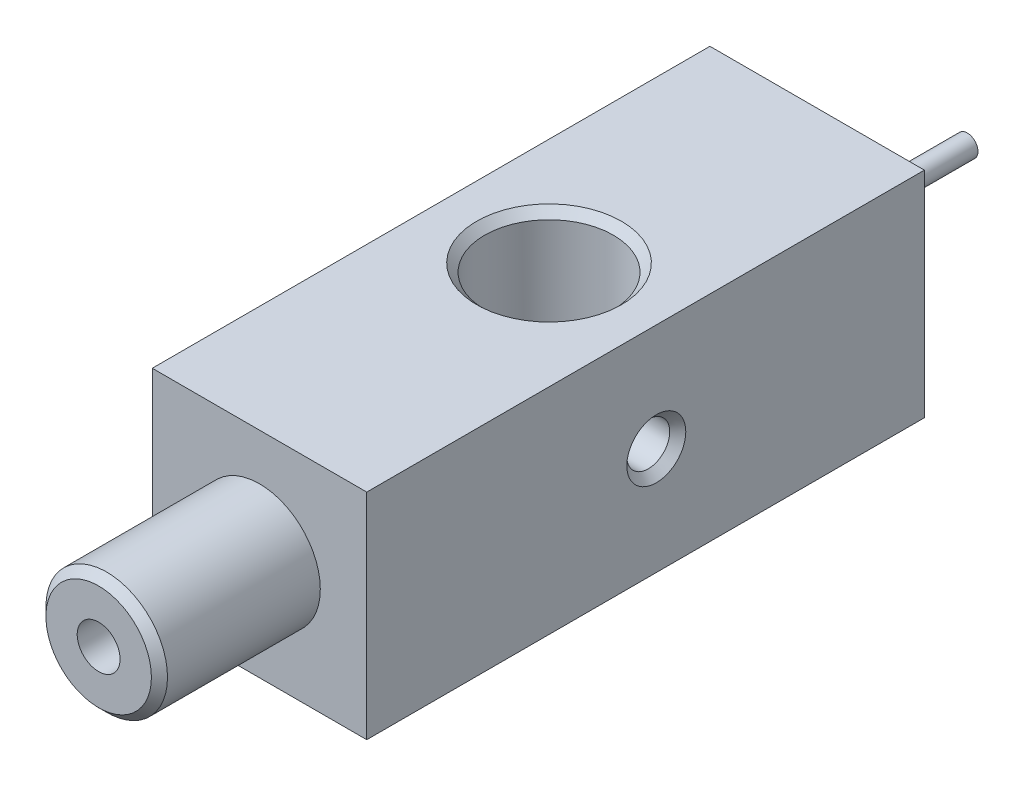
ISO-10303-21;
HEADER;
FILE_DESCRIPTION(('STEP AP214'),'2;1');
FILE_NAME('part.step','',(''),(''),'','','');
FILE_SCHEMA(('AUTOMOTIVE_DESIGN { 1 0 10303 214 1 1 1 1 }'));
ENDSEC;
DATA;
#1=APPLICATION_CONTEXT('core data for automotive mechanical design processes');
#2=APPLICATION_PROTOCOL_DEFINITION('international standard','automotive_design',2000,#1);
#3=PRODUCT_CONTEXT('',#1,'mechanical');
#4=PRODUCT('Part','Part','',(#3));
#5=PRODUCT_RELATED_PRODUCT_CATEGORY('part','',(#4));
#6=PRODUCT_DEFINITION_FORMATION('','',#4);
#7=PRODUCT_DEFINITION_CONTEXT('part definition',#1,'design');
#8=PRODUCT_DEFINITION('design','',#6,#7);
#9=PRODUCT_DEFINITION_SHAPE('','',#8);
#10=(LENGTH_UNIT() NAMED_UNIT(*) SI_UNIT(.MILLI.,.METRE.));
#11=(NAMED_UNIT(*) PLANE_ANGLE_UNIT() SI_UNIT($,.RADIAN.));
#12=(NAMED_UNIT(*) SI_UNIT($,.STERADIAN.) SOLID_ANGLE_UNIT());
#13=UNCERTAINTY_MEASURE_WITH_UNIT(LENGTH_MEASURE(1.E-05),#10,'distance_accuracy_value','');
#14=(GEOMETRIC_REPRESENTATION_CONTEXT(3) GLOBAL_UNCERTAINTY_ASSIGNED_CONTEXT((#13)) GLOBAL_UNIT_ASSIGNED_CONTEXT((#10,
#11,#12)) REPRESENTATION_CONTEXT('',''));
#15=CARTESIAN_POINT('',(0.,0.,0.));
#16=DIRECTION('',(0.,0.,1.));
#17=DIRECTION('',(1.,0.,0.));
#18=AXIS2_PLACEMENT_3D('',#15,#16,#17);
#19=CARTESIAN_POINT('',(-7.94,-7.935,14.288));
#20=DIRECTION('',(0.,0.,1.));
#21=DIRECTION('',(1.,0.,0.));
#22=AXIS2_PLACEMENT_3D('',#19,#20,#21);
#23=PLANE('',#22);
#24=CARTESIAN_POINT('',(-7.94,-7.935,14.288));
#25=DIRECTION('',(0.,0.,1.));
#26=DIRECTION('',(1.,0.,0.));
#27=AXIS2_PLACEMENT_3D('',#24,#25,#26);
#28=CIRCLE('',#27,1.5875);
#29=CARTESIAN_POINT('',(-6.3525,-7.935,14.288));
#30=VERTEX_POINT('',#29);
#31=EDGE_CURVE('E11',#30,#30,#28,.T.);
#32=ORIENTED_EDGE('',*,*,#31,.T.);
#33=EDGE_LOOP('',(#32));
#34=FACE_BOUND('',#33,.T.);
#35=ADVANCED_FACE('F45',(#34),#23,.T.);
#36=CARTESIAN_POINT('',(-7.94,-7.935,14.288));
#37=DIRECTION('',(0.,0.,1.));
#38=DIRECTION('',(1.,0.,0.));
#39=AXIS2_PLACEMENT_3D('',#36,#37,#38);
#40=CYLINDRICAL_SURFACE('',#39,1.5875);
#41=CARTESIAN_POINT('',(-7.94,-7.935,-14.288));
#42=DIRECTION('',(0.,0.,1.));
#43=DIRECTION('',(1.,0.,0.));
#44=AXIS2_PLACEMENT_3D('',#41,#42,#43);
#45=CIRCLE('',#44,1.58750000000001);
#46=CARTESIAN_POINT('',(-6.35249999999999,-7.935,-14.288));
#47=VERTEX_POINT('',#46);
#48=EDGE_CURVE('E51',#47,#47,#45,.T.);
#49=ORIENTED_EDGE('',*,*,#48,.T.);
#50=EDGE_LOOP('',(#49));
#51=FACE_BOUND('',#50,.T.);
#52=ORIENTED_EDGE('',*,*,#31,.F.);
#53=EDGE_LOOP('',(#52));
#54=FACE_BOUND('',#53,.T.);
#55=ADVANCED_FACE('F57',(#51,#54),#40,.T.);
#56=CARTESIAN_POINT('',(-9.5275,-7.935,-14.288));
#57=DIRECTION('',(0.,0.,-1.));
#58=DIRECTION('',(-1.,0.,0.));
#59=AXIS2_PLACEMENT_3D('',#56,#57,#58);
#60=PLANE('',#59);
#61=ORIENTED_EDGE('',*,*,#48,.F.);
#62=EDGE_LOOP('',(#61));
#63=FACE_BOUND('',#62,.T.);
#64=ADVANCED_FACE('F60',(#63),#60,.T.);
#65=CLOSED_SHELL('',(#35,#55,#64));
#66=MANIFOLD_SOLID_BREP('B2',#65);
#67=CARTESIAN_POINT('',(7.93499999999999,7.935,14.288));
#68=DIRECTION('',(0.,0.,1.));
#69=DIRECTION('',(1.,0.,0.));
#70=AXIS2_PLACEMENT_3D('',#67,#68,#69);
#71=CYLINDRICAL_SURFACE('',#70,1.5875);
#72=CARTESIAN_POINT('',(7.93499999999999,7.935,14.288));
#73=DIRECTION('',(0.,0.,1.));
#74=DIRECTION('',(1.,0.,0.));
#75=AXIS2_PLACEMENT_3D('',#72,#73,#74);
#76=CIRCLE('',#75,1.5875);
#77=CARTESIAN_POINT('',(9.52249999999999,7.935,14.288));
#78=VERTEX_POINT('',#77);
#79=EDGE_CURVE('E44',#78,#78,#76,.T.);
#80=ORIENTED_EDGE('',*,*,#79,.F.);
#81=EDGE_LOOP('',(#80));
#82=FACE_BOUND('',#81,.T.);
#83=CARTESIAN_POINT('',(7.93499999999999,7.935,-14.288));
#84=DIRECTION('',(0.,0.,1.));
#85=DIRECTION('',(1.,0.,0.));
#86=AXIS2_PLACEMENT_3D('',#83,#84,#85);
#87=CIRCLE('',#86,1.5875);
#88=CARTESIAN_POINT('',(9.5225,7.935,-14.288));
#89=VERTEX_POINT('',#88);
#90=EDGE_CURVE('E100',#89,#89,#87,.T.);
#91=ORIENTED_EDGE('',*,*,#90,.T.);
#92=EDGE_LOOP('',(#91));
#93=FACE_BOUND('',#92,.T.);
#94=ADVANCED_FACE('F94',(#82,#93),#71,.T.);
#95=CARTESIAN_POINT('',(6.34749999999999,7.935,14.288));
#96=DIRECTION('',(0.,0.,-1.));
#97=DIRECTION('',(-1.,0.,0.));
#98=AXIS2_PLACEMENT_3D('',#95,#96,#97);
#99=PLANE('',#98);
#100=ORIENTED_EDGE('',*,*,#79,.T.);
#101=EDGE_LOOP('',(#100));
#102=FACE_BOUND('',#101,.T.);
#103=ADVANCED_FACE('F109',(#102),#99,.F.);
#104=CARTESIAN_POINT('',(7.93499999999999,7.935,-14.288));
#105=DIRECTION('',(0.,0.,1.));
#106=DIRECTION('',(1.,0.,0.));
#107=AXIS2_PLACEMENT_3D('',#104,#105,#106);
#108=PLANE('',#107);
#109=ORIENTED_EDGE('',*,*,#90,.F.);
#110=EDGE_LOOP('',(#109));
#111=FACE_BOUND('',#110,.T.);
#112=ADVANCED_FACE('F107',(#111),#108,.F.);
#113=CLOSED_SHELL('',(#94,#103,#112));
#114=MANIFOLD_SOLID_BREP('B6',#113);
#115=CARTESIAN_POINT('',(0.,0.,82.55));
#116=DIRECTION('',(0.,0.,1.));
#117=DIRECTION('',(1.,0.,0.));
#118=AXIS2_PLACEMENT_3D('',#115,#116,#117);
#119=PLANE('',#118);
#120=DIRECTION('',(0.,1.,0.));
#121=VECTOR('',#120,1.);
#122=CARTESIAN_POINT('',(15.875,15.875,82.55));
#123=LINE('',#122,#121);
#124=CARTESIAN_POINT('',(15.875,-15.875,82.55));
#125=VERTEX_POINT('',#124);
#126=CARTESIAN_POINT('',(15.875,15.875,82.55));
#127=VERTEX_POINT('',#126);
#128=EDGE_CURVE('E330',#125,#127,#123,.T.);
#129=ORIENTED_EDGE('',*,*,#128,.T.);
#130=DIRECTION('',(-1.,0.,0.));
#131=VECTOR('',#130,1.);
#132=CARTESIAN_POINT('',(-15.875,15.875,82.55));
#133=LINE('',#132,#131);
#134=CARTESIAN_POINT('',(-15.875,15.875,82.55));
#135=VERTEX_POINT('',#134);
#136=EDGE_CURVE('E186',#127,#135,#133,.T.);
#137=ORIENTED_EDGE('',*,*,#136,.T.);
#138=DIRECTION('',(0.,-1.,0.));
#139=VECTOR('',#138,1.);
#140=CARTESIAN_POINT('',(-15.875,15.875,82.55));
#141=LINE('',#140,#139);
#142=CARTESIAN_POINT('',(-15.875,-15.875,82.55));
#143=VERTEX_POINT('',#142);
#144=EDGE_CURVE('E333',#135,#143,#141,.T.);
#145=ORIENTED_EDGE('',*,*,#144,.T.);
#146=DIRECTION('',(1.,0.,0.));
#147=VECTOR('',#146,1.);
#148=CARTESIAN_POINT('',(-15.875,-15.875,82.55));
#149=LINE('',#148,#147);
#150=EDGE_CURVE('E154',#143,#125,#149,.T.);
#151=ORIENTED_EDGE('',*,*,#150,.T.);
#152=EDGE_LOOP('',(#129,#137,#145,#151));
#153=FACE_BOUND('',#152,.T.);
#154=CARTESIAN_POINT('',(0.,0.,82.55));
#155=DIRECTION('',(0.,0.,1.));
#156=DIRECTION('',(1.,0.,0.));
#157=AXIS2_PLACEMENT_3D('',#154,#155,#156);
#158=CIRCLE('',#157,9.);
#159=CARTESIAN_POINT('',(9.,0.,82.55));
#160=VERTEX_POINT('',#159);
#161=EDGE_CURVE('E324',#160,#160,#158,.T.);
#162=ORIENTED_EDGE('',*,*,#161,.F.);
#163=EDGE_LOOP('',(#162));
#164=FACE_BOUND('',#163,.T.);
#165=ADVANCED_FACE('F137',(#153,#164),#119,.T.);
#166=CARTESIAN_POINT('',(15.875,15.875,82.55));
#167=DIRECTION('',(-1.,0.,0.));
#168=DIRECTION('',(0.,-1.,0.));
#169=AXIS2_PLACEMENT_3D('',#166,#167,#168);
#170=PLANE('',#169);
#171=CARTESIAN_POINT('',(15.875,0.,39.688));
#172=DIRECTION('',(-1.,0.,0.));
#173=DIRECTION('',(0.,-1.,0.));
#174=AXIS2_PLACEMENT_3D('',#171,#172,#173);
#175=CIRCLE('',#174,4.36562499999998);
#176=CARTESIAN_POINT('',(15.875,-4.36562499999999,39.688));
#177=VERTEX_POINT('',#176);
#178=EDGE_CURVE('E92',#177,#177,#175,.T.);
#179=ORIENTED_EDGE('',*,*,#178,.T.);
#180=EDGE_LOOP('',(#179));
#181=FACE_BOUND('',#180,.T.);
#182=DIRECTION('',(0.,1.,0.));
#183=VECTOR('',#182,1.);
#184=CARTESIAN_POINT('',(15.875,15.875,0.));
#185=LINE('',#184,#183);
#186=CARTESIAN_POINT('',(15.875,-15.875,0.));
#187=VERTEX_POINT('',#186);
#188=CARTESIAN_POINT('',(15.875,15.875,0.));
#189=VERTEX_POINT('',#188);
#190=EDGE_CURVE('E329',#187,#189,#185,.T.);
#191=ORIENTED_EDGE('',*,*,#190,.T.);
#192=DIRECTION('',(0.,0.,-1.));
#193=VECTOR('',#192,1.);
#194=CARTESIAN_POINT('',(15.875,15.875,82.55));
#195=LINE('',#194,#193);
#196=EDGE_CURVE('E348',#127,#189,#195,.T.);
#197=ORIENTED_EDGE('',*,*,#196,.F.);
#198=ORIENTED_EDGE('',*,*,#128,.F.);
#199=DIRECTION('',(0.,0.,-1.));
#200=VECTOR('',#199,1.);
#201=CARTESIAN_POINT('',(15.875,-15.875,82.55));
#202=LINE('',#201,#200);
#203=EDGE_CURVE('E336',#125,#187,#202,.T.);
#204=ORIENTED_EDGE('',*,*,#203,.T.);
#205=EDGE_LOOP('',(#191,#197,#198,#204));
#206=FACE_BOUND('',#205,.T.);
#207=ADVANCED_FACE('F233',(#181,#206),#170,.F.);
#208=CARTESIAN_POINT('',(-15.875,15.875,82.55));
#209=DIRECTION('',(0.,-1.,0.));
#210=DIRECTION('',(0.,0.,-1.));
#211=AXIS2_PLACEMENT_3D('',#208,#209,#210);
#212=PLANE('',#211);
#213=CARTESIAN_POINT('',(0.,15.875,39.688));
#214=DIRECTION('',(0.,-1.,0.));
#215=DIRECTION('',(0.,0.,-1.));
#216=AXIS2_PLACEMENT_3D('',#213,#214,#215);
#217=CIRCLE('',#216,10.715625);
#218=CARTESIAN_POINT('',(0.,15.875,28.972375));
#219=VERTEX_POINT('',#218);
#220=EDGE_CURVE('E353',#219,#219,#217,.T.);
#221=ORIENTED_EDGE('',*,*,#220,.T.);
#222=EDGE_LOOP('',(#221));
#223=FACE_BOUND('',#222,.T.);
#224=DIRECTION('',(-1.,0.,0.));
#225=VECTOR('',#224,1.);
#226=CARTESIAN_POINT('',(-15.875,15.875,0.));
#227=LINE('',#226,#225);
#228=CARTESIAN_POINT('',(-15.875,15.875,0.));
#229=VERTEX_POINT('',#228);
#230=EDGE_CURVE('E339',#189,#229,#227,.T.);
#231=ORIENTED_EDGE('',*,*,#230,.T.);
#232=DIRECTION('',(0.,0.,-1.));
#233=VECTOR('',#232,1.);
#234=CARTESIAN_POINT('',(-15.875,15.875,82.55));
#235=LINE('',#234,#233);
#236=EDGE_CURVE('E346',#135,#229,#235,.T.);
#237=ORIENTED_EDGE('',*,*,#236,.F.);
#238=ORIENTED_EDGE('',*,*,#136,.F.);
#239=ORIENTED_EDGE('',*,*,#196,.T.);
#240=EDGE_LOOP('',(#231,#237,#238,#239));
#241=FACE_BOUND('',#240,.T.);
#242=ADVANCED_FACE('F238',(#223,#241),#212,.F.);
#243=CARTESIAN_POINT('',(-15.875,15.875,82.55));
#244=DIRECTION('',(1.,0.,0.));
#245=DIRECTION('',(0.,1.,0.));
#246=AXIS2_PLACEMENT_3D('',#243,#244,#245);
#247=PLANE('',#246);
#248=CARTESIAN_POINT('',(-15.875,0.,39.688));
#249=DIRECTION('',(1.,0.,0.));
#250=DIRECTION('',(0.,1.,0.));
#251=AXIS2_PLACEMENT_3D('',#248,#249,#250);
#252=CIRCLE('',#251,4.36562499999999);
#253=CARTESIAN_POINT('',(-15.875,4.36562499999999,39.688));
#254=VERTEX_POINT('',#253);
#255=EDGE_CURVE('E281',#254,#254,#252,.T.);
#256=ORIENTED_EDGE('',*,*,#255,.T.);
#257=EDGE_LOOP('',(#256));
#258=FACE_BOUND('',#257,.T.);
#259=DIRECTION('',(0.,-1.,0.));
#260=VECTOR('',#259,1.);
#261=CARTESIAN_POINT('',(-15.875,15.875,0.));
#262=LINE('',#261,#260);
#263=CARTESIAN_POINT('',(-15.875,-15.875,0.));
#264=VERTEX_POINT('',#263);
#265=EDGE_CURVE('E172',#229,#264,#262,.T.);
#266=ORIENTED_EDGE('',*,*,#265,.T.);
#267=DIRECTION('',(0.,0.,-1.));
#268=VECTOR('',#267,1.);
#269=CARTESIAN_POINT('',(-15.875,-15.875,82.55));
#270=LINE('',#269,#268);
#271=EDGE_CURVE('E344',#143,#264,#270,.T.);
#272=ORIENTED_EDGE('',*,*,#271,.F.);
#273=ORIENTED_EDGE('',*,*,#144,.F.);
#274=ORIENTED_EDGE('',*,*,#236,.T.);
#275=EDGE_LOOP('',(#266,#272,#273,#274));
#276=FACE_BOUND('',#275,.T.);
#277=ADVANCED_FACE('F253',(#258,#276),#247,.F.);
#278=CARTESIAN_POINT('',(-15.875,-15.875,82.55));
#279=DIRECTION('',(0.,1.,0.));
#280=DIRECTION('',(0.,0.,1.));
#281=AXIS2_PLACEMENT_3D('',#278,#279,#280);
#282=PLANE('',#281);
#283=CARTESIAN_POINT('',(0.,-15.875,39.688));
#284=DIRECTION('',(0.,1.,0.));
#285=DIRECTION('',(0.,0.,1.));
#286=AXIS2_PLACEMENT_3D('',#283,#284,#285);
#287=CIRCLE('',#286,10.715625);
#288=CARTESIAN_POINT('',(0.,-15.875,50.403625));
#289=VERTEX_POINT('',#288);
#290=EDGE_CURVE('E359',#289,#289,#287,.T.);
#291=ORIENTED_EDGE('',*,*,#290,.T.);
#292=EDGE_LOOP('',(#291));
#293=FACE_BOUND('',#292,.T.);
#294=DIRECTION('',(1.,0.,0.));
#295=VECTOR('',#294,1.);
#296=CARTESIAN_POINT('',(-15.875,-15.875,0.));
#297=LINE('',#296,#295);
#298=EDGE_CURVE('E178',#264,#187,#297,.T.);
#299=ORIENTED_EDGE('',*,*,#298,.T.);
#300=ORIENTED_EDGE('',*,*,#203,.F.);
#301=ORIENTED_EDGE('',*,*,#150,.F.);
#302=ORIENTED_EDGE('',*,*,#271,.T.);
#303=EDGE_LOOP('',(#299,#300,#301,#302));
#304=FACE_BOUND('',#303,.T.);
#305=ADVANCED_FACE('F249',(#293,#304),#282,.F.);
#306=CARTESIAN_POINT('',(0.,0.,0.));
#307=DIRECTION('',(0.,0.,1.));
#308=DIRECTION('',(1.,0.,0.));
#309=AXIS2_PLACEMENT_3D('',#306,#307,#308);
#310=PLANE('',#309);
#311=CARTESIAN_POINT('',(0.,0.,0.));
#312=DIRECTION('',(0.,0.,-1.));
#313=DIRECTION('',(-1.,0.,0.));
#314=AXIS2_PLACEMENT_3D('',#311,#312,#313);
#315=CIRCLE('',#314,3.175);
#316=CARTESIAN_POINT('',(-3.175,0.,0.));
#317=VERTEX_POINT('',#316);
#318=EDGE_CURVE('E203',#317,#317,#315,.T.);
#319=ORIENTED_EDGE('',*,*,#318,.F.);
#320=EDGE_LOOP('',(#319));
#321=FACE_BOUND('',#320,.T.);
#322=CARTESIAN_POINT('',(-7.94,-7.94,0.));
#323=DIRECTION('',(0.,0.,-1.));
#324=DIRECTION('',(-1.,0.,0.));
#325=AXIS2_PLACEMENT_3D('',#322,#323,#324);
#326=CIRCLE('',#325,1.5875);
#327=CARTESIAN_POINT('',(-9.5275,-7.94,0.));
#328=VERTEX_POINT('',#327);
#329=EDGE_CURVE('E312',#328,#328,#326,.T.);
#330=ORIENTED_EDGE('',*,*,#329,.F.);
#331=EDGE_LOOP('',(#330));
#332=FACE_BOUND('',#331,.T.);
#333=CARTESIAN_POINT('',(7.93499999999999,7.935,0.));
#334=DIRECTION('',(0.,0.,-1.));
#335=DIRECTION('',(-1.,0.,0.));
#336=AXIS2_PLACEMENT_3D('',#333,#334,#335);
#337=CIRCLE('',#336,1.5875);
#338=CARTESIAN_POINT('',(6.34749999999999,7.935,0.));
#339=VERTEX_POINT('',#338);
#340=EDGE_CURVE('E318',#339,#339,#337,.T.);
#341=ORIENTED_EDGE('',*,*,#340,.F.);
#342=EDGE_LOOP('',(#341));
#343=FACE_BOUND('',#342,.T.);
#344=ORIENTED_EDGE('',*,*,#190,.F.);
#345=ORIENTED_EDGE('',*,*,#298,.F.);
#346=ORIENTED_EDGE('',*,*,#265,.F.);
#347=ORIENTED_EDGE('',*,*,#230,.F.);
#348=EDGE_LOOP('',(#344,#345,#346,#347));
#349=FACE_BOUND('',#348,.T.);
#350=ADVANCED_FACE('F246',(#321,#332,#343,#349),#310,.F.);
#351=CARTESIAN_POINT('',(0.,-15.876,39.688));
#352=DIRECTION('',(0.,1.,0.));
#353=DIRECTION('',(0.,0.,1.));
#354=AXIS2_PLACEMENT_3D('',#351,#352,#353);
#355=CYLINDRICAL_SURFACE('',#354,9.525);
#356=CARTESIAN_POINT('',(0.,-14.684375,39.688));
#357=DIRECTION('',(0.,1.,0.));
#358=DIRECTION('',(0.,0.,1.));
#359=AXIS2_PLACEMENT_3D('',#356,#357,#358);
#360=CIRCLE('',#359,9.525);
#361=CARTESIAN_POINT('',(0.,-14.684375,49.213));
#362=VERTEX_POINT('',#361);
#363=EDGE_CURVE('E356',#362,#362,#360,.F.);
#364=ORIENTED_EDGE('',*,*,#363,.T.);
#365=EDGE_LOOP('',(#364));
#366=FACE_BOUND('',#365,.T.);
#367=CARTESIAN_POINT('',(0.,14.684375,39.688));
#368=DIRECTION('',(0.,-1.,0.));
#369=DIRECTION('',(0.,0.,-1.));
#370=AXIS2_PLACEMENT_3D('',#367,#368,#369);
#371=CIRCLE('',#370,9.525);
#372=CARTESIAN_POINT('',(0.,14.684375,30.163));
#373=VERTEX_POINT('',#372);
#374=EDGE_CURVE('E350',#373,#373,#371,.F.);
#375=ORIENTED_EDGE('',*,*,#374,.T.);
#376=EDGE_LOOP('',(#375));
#377=FACE_BOUND('',#376,.T.);
#378=CARTESIAN_POINT('',(8.98025612106916,0.,36.513));
#379=CARTESIAN_POINT('',(8.98025555134128,0.172936455104526,36.512999181016));
#380=CARTESIAN_POINT('',(8.98530617498472,0.345867989439904,36.5271770617985));
#381=CARTESIAN_POINT('',(9.00485797707984,0.686607786656737,36.583322656888));
#382=CARTESIAN_POINT('',(9.01936071226449,0.854415200845086,36.6252949488654));
#383=CARTESIAN_POINT('',(9.05599546711913,1.17991538526638,36.7353913329504));
#384=CARTESIAN_POINT('',(9.07811252608947,1.33762727598062,36.8034641720447));
#385=CARTESIAN_POINT('',(9.12746212382781,1.63944315413977,36.9636543296986));
#386=CARTESIAN_POINT('',(9.15469579088969,1.78354412960777,37.0557769533689));
#387=CARTESIAN_POINT('',(9.21240503868727,2.05968588042414,37.2653126100439));
#388=CARTESIAN_POINT('',(9.24296141131745,2.19111648603273,37.3835077161251));
#389=CARTESIAN_POINT('',(9.30319020743184,2.43270659388822,37.6401641565943));
#390=CARTESIAN_POINT('',(9.33286248831953,2.54286268027401,37.7786287392087));
#391=CARTESIAN_POINT('',(9.38891527476712,2.74154549902145,38.0763556872111));
#392=CARTESIAN_POINT('',(9.41518969452597,2.82943290671201,38.2360664318621));
#393=CARTESIAN_POINT('',(9.46053437997871,2.97685328277983,38.5690308670148));
#394=CARTESIAN_POINT('',(9.47960658694531,3.03639389283666,38.7422808929431));
#395=CARTESIAN_POINT('',(9.50782564496303,3.12336133845784,39.0910085046487));
#396=CARTESIAN_POINT('',(9.5172947441875,3.15183344186599,39.2661988533418));
#397=CARTESIAN_POINT('',(9.52638456092937,3.17917923142008,39.6191092474335));
#398=CARTESIAN_POINT('',(9.52600781684693,3.1780605464964,39.7968286290019));
#399=CARTESIAN_POINT('',(9.51566675789472,3.14691949175285,40.1423536607404));
#400=CARTESIAN_POINT('',(9.50607905597498,3.11803247209349,40.3102747542785));
#401=CARTESIAN_POINT('',(9.47886621303648,3.03405228538699,40.6387329182604));
#402=CARTESIAN_POINT('',(9.46124052729002,2.97895734223905,40.799269487449));
#403=CARTESIAN_POINT('',(9.41945253180987,2.84346231755325,41.1108841076233));
#404=CARTESIAN_POINT('',(9.3952073501375,2.76273914511481,41.2618101015761));
#405=CARTESIAN_POINT('',(9.34270397898568,2.57854543520051,41.5483097335492));
#406=CARTESIAN_POINT('',(9.31444467439657,2.47506857243477,41.6838790866734));
#407=CARTESIAN_POINT('',(9.25532159123421,2.24258380076545,41.9425702513004));
#408=CARTESIAN_POINT('',(9.22439783161187,2.11260322385329,42.0648054986822));
#409=CARTESIAN_POINT('',(9.1645528941526,1.83372529581798,42.2860302992242));
#410=CARTESIAN_POINT('',(9.13563202542329,1.68482503481346,42.3850162699189));
#411=CARTESIAN_POINT('',(9.08273917259532,1.36952473870907,42.5581601697385));
#412=CARTESIAN_POINT('',(9.05884361979074,1.20290548306606,42.6319440219977));
#413=CARTESIAN_POINT('',(9.01959241367422,0.858610823369217,42.7501071386301));
#414=CARTESIAN_POINT('',(9.00423318171519,0.680940087170164,42.7944987264983));
#415=CARTESIAN_POINT('',(8.98460345301983,0.328173221568245,42.8508120706596));
#416=CARTESIAN_POINT('',(8.9798639401205,0.153322576423011,42.8641083782367));
#417=CARTESIAN_POINT('',(8.9806993378791,-0.196139273437293,42.8617472685384));
#418=CARTESIAN_POINT('',(8.98627237514011,-0.370750515876168,42.846095110095));
#419=CARTESIAN_POINT('',(9.00663737436701,-0.708523366135315,42.7875164436786));
#420=CARTESIAN_POINT('',(9.02110608274668,-0.871872240728922,42.7455453008887));
#421=CARTESIAN_POINT('',(9.05727657905498,-1.18917594980941,42.6366665136295));
#422=CARTESIAN_POINT('',(9.07897964918116,-1.34312911330073,42.5697544484539));
#423=CARTESIAN_POINT('',(9.12802586366623,-1.64268283618922,42.4104810318461));
#424=CARTESIAN_POINT('',(9.1555260648837,-1.78786359038772,42.3173798007882));
#425=CARTESIAN_POINT('',(9.21276315720814,-2.06103871631831,42.1092093770202));
#426=CARTESIAN_POINT('',(9.24250070609047,-2.18902800274937,41.9941337084586));
#427=CARTESIAN_POINT('',(9.30259247675171,-2.43055134948777,41.7387061662335));
#428=CARTESIAN_POINT('',(9.33290753359821,-2.54309368830984,41.5974045839856));
#429=CARTESIAN_POINT('',(9.3893275387162,-2.74293375195503,41.2971766501958));
#430=CARTESIAN_POINT('',(9.41543263651181,-2.83023237344069,41.1382509249449));
#431=CARTESIAN_POINT('',(9.46036988448665,-2.97630883293594,40.8080760632225));
#432=CARTESIAN_POINT('',(9.47924920264386,-3.0352723049451,40.6369158165448));
#433=CARTESIAN_POINT('',(9.50781089409934,-3.12333558104083,40.2863556290611));
#434=CARTESIAN_POINT('',(9.51749658708009,-3.15244616487059,40.1069586869536));
#435=CARTESIAN_POINT('',(9.52632915775114,-3.17900709639791,39.7540886913556));
#436=CARTESIAN_POINT('',(9.52594996283969,-3.17788116623529,39.5807335015539));
#437=CARTESIAN_POINT('',(9.51586223949089,-3.14751304663515,39.2367971146245));
#438=CARTESIAN_POINT('',(9.50615446789103,-3.11827313811495,39.0662156935995));
#439=CARTESIAN_POINT('',(9.47867404980259,-3.03345140522132,38.7353662708032));
#440=CARTESIAN_POINT('',(9.46103195296647,-2.97829536625443,38.5749774898519));
#441=CARTESIAN_POINT('',(9.41949985236772,-2.84360133876653,38.2656687357662));
#442=CARTESIAN_POINT('',(9.39560871852452,-2.76405893974948,38.1167508433478));
#443=CARTESIAN_POINT('',(9.34294133528522,-2.57946679907612,37.8286119982196));
#444=CARTESIAN_POINT('',(9.31401720161867,-2.47358317391329,37.6899526513046));
#445=CARTESIAN_POINT('',(9.25490239414217,-2.24073278307908,37.431905241585));
#446=CARTESIAN_POINT('',(9.22471131854583,-2.11375929081583,37.3125233513419));
#447=CARTESIAN_POINT('',(9.16505913446274,-1.83639029601143,37.0916697569549));
#448=CARTESIAN_POINT('',(9.13567286363902,-1.68527250264916,36.9910820829567));
#449=CARTESIAN_POINT('',(9.08241113800574,-1.36736319458367,36.816801960019));
#450=CARTESIAN_POINT('',(9.05853424386967,-1.20057578963081,36.7431024835982));
#451=CARTESIAN_POINT('',(9.02021736105684,-0.863721208750368,36.6277958454518));
#452=CARTESIAN_POINT('',(9.00539959321554,-0.694143063306962,36.5848886384503));
#453=CARTESIAN_POINT('',(8.9854209273797,-0.349707039768224,36.5274960335261));
#454=CARTESIAN_POINT('',(8.98025669710439,-0.174851004721,36.5130008280508));
#455=CARTESIAN_POINT('',(8.98025612106916,0.,36.513));
#456=B_SPLINE_CURVE_WITH_KNOTS('',3,(#378,#379,#380,#381,#382,#383,#384,#385,#386,#387,#388,
#389,#390,#391,#392,#393,#394,#395,#396,#397,#398,#399,#400,#401,#402,#403,#404,#405,#406,#407,
#408,#409,#410,#411,#412,#413,#414,#415,#416,#417,#418,#419,#420,#421,#422,#423,#424,#425,#426,
#427,#428,#429,#430,#431,#432,#433,#434,#435,#436,#437,#438,#439,#440,#441,#442,#443,#444,#445,
#446,#447,#448,#449,#450,#451,#452,#453,#454,#455),.UNSPECIFIED.,.T.,.F.,(4,2,2,2,2,2,2,2,2,2,2,
2,2,2,2,2,2,2,2,2,2,2,2,2,2,2,2,2,2,2,2,2,2,2,2,2,2,2,4),(0.,0.518161856737954,1.03640907467314,
1.55364379231512,2.07099270263877,2.60671746332528,3.14252816921061,3.69231882006111,
4.24196117528054,4.77247962078666,5.30286129234888,5.8124409032118,6.32205505300825,
6.83836754181562,7.35482374200018,7.89559553605436,8.43645060268434,8.98501631501699,
9.53335188057253,10.0569487508209,10.5804505128321,11.0859695656586,11.5915782629155,
12.1132237331089,12.6350231697725,13.1819271594322,13.7288117205516,14.2720628703095,
14.8151177853819,15.3326491885149,15.8501386073105,16.3594083542836,16.8687702617329,
17.3969527447801,17.925304015736,18.4743376618725,19.023227709973,19.5473069861654,
20.0712053232972),.UNSPECIFIED.);
#457=CARTESIAN_POINT('',(8.98025612106916,0.,36.513));
#458=VERTEX_POINT('',#457);
#459=EDGE_CURVE('E202',#458,#458,#456,.T.);
#460=ORIENTED_EDGE('',*,*,#459,.T.);
#461=EDGE_LOOP('',(#460));
#462=FACE_BOUND('',#461,.T.);
#463=CARTESIAN_POINT('',(-8.98025612106916,0.,42.863));
#464=CARTESIAN_POINT('',(-8.98025555134128,0.172936455104524,42.863000818984));
#465=CARTESIAN_POINT('',(-8.98530617498472,0.345867989439902,42.8488229382015));
#466=CARTESIAN_POINT('',(-9.00485797707984,0.686607786656735,42.792677343112));
#467=CARTESIAN_POINT('',(-9.01936071226449,0.854415200845084,42.7507050511347));
#468=CARTESIAN_POINT('',(-9.05599546711913,1.17991538526638,42.6406086670496));
#469=CARTESIAN_POINT('',(-9.07811252608947,1.33762727598062,42.5725358279553));
#470=CARTESIAN_POINT('',(-9.12746212382781,1.63944315413977,42.4123456703014));
#471=CARTESIAN_POINT('',(-9.15469579088969,1.78354412960777,42.3202230466311));
#472=CARTESIAN_POINT('',(-9.21240503868727,2.05968588042413,42.1106873899561));
#473=CARTESIAN_POINT('',(-9.24296141131745,2.19111648603273,41.9924922838749));
#474=CARTESIAN_POINT('',(-9.30319020743184,2.43270659388822,41.7358358434057));
#475=CARTESIAN_POINT('',(-9.33286248831953,2.54286268027401,41.5973712607913));
#476=CARTESIAN_POINT('',(-9.38891527476712,2.74154549902145,41.2996443127889));
#477=CARTESIAN_POINT('',(-9.41518969452597,2.82943290671201,41.1399335681379));
#478=CARTESIAN_POINT('',(-9.46053437997871,2.97685328277983,40.8069691329852));
#479=CARTESIAN_POINT('',(-9.47960658694531,3.03639389283666,40.6337191070569));
#480=CARTESIAN_POINT('',(-9.50782564496303,3.12336133845783,40.2849914953513));
#481=CARTESIAN_POINT('',(-9.5172947441875,3.15183344186598,40.1098011466582));
#482=CARTESIAN_POINT('',(-9.52638456092937,3.17917923142008,39.7568907525665));
#483=CARTESIAN_POINT('',(-9.52600781684693,3.1780605464964,39.5791713709981));
#484=CARTESIAN_POINT('',(-9.51566675789472,3.14691949175285,39.2336463392596));
#485=CARTESIAN_POINT('',(-9.50607905597498,3.11803247209349,39.0657252457215));
#486=CARTESIAN_POINT('',(-9.47886621303648,3.03405228538699,38.7372670817396));
#487=CARTESIAN_POINT('',(-9.46124052729002,2.97895734223904,38.576730512551));
#488=CARTESIAN_POINT('',(-9.41945253180987,2.84346231755325,38.2651158923767));
#489=CARTESIAN_POINT('',(-9.3952073501375,2.76273914511481,38.1141898984239));
#490=CARTESIAN_POINT('',(-9.34270397898568,2.57854543520051,37.8276902664508));
#491=CARTESIAN_POINT('',(-9.31444467439657,2.47506857243476,37.6921209133265));
#492=CARTESIAN_POINT('',(-9.25532159123421,2.24258380076545,37.4334297486996));
#493=CARTESIAN_POINT('',(-9.22439783161187,2.11260322385329,37.3111945013178));
#494=CARTESIAN_POINT('',(-9.1645528941526,1.83372529581798,37.0899697007758));
#495=CARTESIAN_POINT('',(-9.13563202542329,1.68482503481345,36.9909837300811));
#496=CARTESIAN_POINT('',(-9.08273917259532,1.36952473870907,36.8178398302615));
#497=CARTESIAN_POINT('',(-9.05884361979074,1.20290548306606,36.7440559780023));
#498=CARTESIAN_POINT('',(-9.01959241367422,0.858610823369214,36.6258928613699));
#499=CARTESIAN_POINT('',(-9.00423318171519,0.680940087170161,36.5815012735017));
#500=CARTESIAN_POINT('',(-8.98460345301983,0.328173221568243,36.5251879293404));
#501=CARTESIAN_POINT('',(-8.9798639401205,0.153322576423009,36.5118916217633));
#502=CARTESIAN_POINT('',(-8.9806993378791,-0.196139273437295,36.5142527314617));
#503=CARTESIAN_POINT('',(-8.98627237514011,-0.370750515876169,36.529904889905));
#504=CARTESIAN_POINT('',(-9.00663737436701,-0.708523366135317,36.5884835563214));
#505=CARTESIAN_POINT('',(-9.02110608274668,-0.871872240728924,36.6304546991113));
#506=CARTESIAN_POINT('',(-9.05727657905498,-1.18917594980941,36.7393334863705));
#507=CARTESIAN_POINT('',(-9.07897964918116,-1.34312911330073,36.8062455515461));
#508=CARTESIAN_POINT('',(-9.12802586366623,-1.64268283618922,36.9655189681539));
#509=CARTESIAN_POINT('',(-9.1555260648837,-1.78786359038772,37.0586201992118));
#510=CARTESIAN_POINT('',(-9.21276315720814,-2.06103871631831,37.2667906229798));
#511=CARTESIAN_POINT('',(-9.24250070609047,-2.18902800274937,37.3818662915414));
#512=CARTESIAN_POINT('',(-9.30259247675171,-2.43055134948778,37.6372938337665));
#513=CARTESIAN_POINT('',(-9.33290753359821,-2.54309368830985,37.7785954160144));
#514=CARTESIAN_POINT('',(-9.3893275387162,-2.74293375195503,38.0788233498042));
#515=CARTESIAN_POINT('',(-9.41543263651181,-2.83023237344069,38.237749075055));
#516=CARTESIAN_POINT('',(-9.46036988448664,-2.97630883293594,38.5679239367775));
#517=CARTESIAN_POINT('',(-9.47924920264386,-3.0352723049451,38.7390841834552));
#518=CARTESIAN_POINT('',(-9.50781089409934,-3.12333558104083,39.0896443709389));
#519=CARTESIAN_POINT('',(-9.51749658708009,-3.15244616487059,39.2690413130464));
#520=CARTESIAN_POINT('',(-9.52632915775114,-3.17900709639791,39.6219113086444));
#521=CARTESIAN_POINT('',(-9.52594996283969,-3.17788116623529,39.7952664984461));
#522=CARTESIAN_POINT('',(-9.51586223949089,-3.14751304663515,40.1392028853755));
#523=CARTESIAN_POINT('',(-9.50615446789103,-3.11827313811496,40.3097843064005));
#524=CARTESIAN_POINT('',(-9.47867404980259,-3.03345140522132,40.6406337291968));
#525=CARTESIAN_POINT('',(-9.46103195296647,-2.97829536625444,40.8010225101481));
#526=CARTESIAN_POINT('',(-9.41949985236772,-2.84360133876653,41.1103312642338));
#527=CARTESIAN_POINT('',(-9.39560871852452,-2.76405893974948,41.2592491566522));
#528=CARTESIAN_POINT('',(-9.34294133528522,-2.57946679907612,41.5473880017804));
#529=CARTESIAN_POINT('',(-9.31401720161867,-2.47358317391329,41.6860473486954));
#530=CARTESIAN_POINT('',(-9.25490239414218,-2.24073278307908,41.944094758415));
#531=CARTESIAN_POINT('',(-9.22471131854583,-2.11375929081584,42.0634766486581));
#532=CARTESIAN_POINT('',(-9.16505913446274,-1.83639029601143,42.2843302430451));
#533=CARTESIAN_POINT('',(-9.13567286363902,-1.68527250264916,42.3849179170433));
#534=CARTESIAN_POINT('',(-9.08241113800574,-1.36736319458367,42.559198039981));
#535=CARTESIAN_POINT('',(-9.05853424386967,-1.20057578963081,42.6328975164018));
#536=CARTESIAN_POINT('',(-9.02021736105684,-0.863721208750369,42.7482041545482));
#537=CARTESIAN_POINT('',(-9.00539959321554,-0.694143063306964,42.7911113615497));
#538=CARTESIAN_POINT('',(-8.9854209273797,-0.349707039768226,42.8485039664739));
#539=CARTESIAN_POINT('',(-8.98025669710439,-0.174851004721002,42.8629991719492));
#540=CARTESIAN_POINT('',(-8.98025612106916,0.,42.863));
#541=B_SPLINE_CURVE_WITH_KNOTS('',3,(#463,#464,#465,#466,#467,#468,#469,#470,#471,#472,#473,
#474,#475,#476,#477,#478,#479,#480,#481,#482,#483,#484,#485,#486,#487,#488,#489,#490,#491,#492,
#493,#494,#495,#496,#497,#498,#499,#500,#501,#502,#503,#504,#505,#506,#507,#508,#509,#510,#511,
#512,#513,#514,#515,#516,#517,#518,#519,#520,#521,#522,#523,#524,#525,#526,#527,#528,#529,#530,
#531,#532,#533,#534,#535,#536,#537,#538,#539,#540),.UNSPECIFIED.,.T.,.F.,(4,2,2,2,2,2,2,2,2,2,2,
2,2,2,2,2,2,2,2,2,2,2,2,2,2,2,2,2,2,2,2,2,2,2,2,2,2,2,4),(0.,0.518161856737954,1.03640907467314,
1.55364379231512,2.07099270263877,2.60671746332528,3.14252816921061,3.69231882006111,
4.24196117528054,4.77247962078664,5.30286129234888,5.8124409032118,6.32205505300825,
6.83836754181562,7.35482374200018,7.89559553605436,8.43645060268434,8.98501631501699,
9.53335188057253,10.0569487508209,10.5804505128321,11.0859695656586,11.5915782629155,
12.1132237331089,12.6350231697725,13.1819271594322,13.7288117205516,14.2720628703095,
14.8151177853819,15.3326491885149,15.8501386073105,16.3594083542836,16.8687702617329,
17.3969527447801,17.925304015736,18.4743376618725,19.023227709973,19.5473069861654,
20.0712053232972),.UNSPECIFIED.);
#542=CARTESIAN_POINT('',(-8.98025612106916,0.,42.863));
#543=VERTEX_POINT('',#542);
#544=EDGE_CURVE('E206',#543,#543,#541,.T.);
#545=ORIENTED_EDGE('',*,*,#544,.T.);
#546=EDGE_LOOP('',(#545));
#547=FACE_BOUND('',#546,.T.);
#548=ADVANCED_FACE('F244',(#366,#377,#462,#547),#355,.F.);
#549=CARTESIAN_POINT('',(0.,0.,106.362));
#550=DIRECTION('',(0.,0.,-1.));
#551=DIRECTION('',(-1.,0.,0.));
#552=AXIS2_PLACEMENT_3D('',#549,#550,#551);
#553=CYLINDRICAL_SURFACE('',#552,9.);
#554=CARTESIAN_POINT('',(0.,0.,105.171375));
#555=DIRECTION('',(0.,0.,1.));
#556=DIRECTION('',(1.,0.,0.));
#557=AXIS2_PLACEMENT_3D('',#554,#555,#556);
#558=CIRCLE('',#557,9.);
#559=CARTESIAN_POINT('',(9.,0.,105.171375));
#560=VERTEX_POINT('',#559);
#561=EDGE_CURVE('E286',#560,#560,#558,.F.);
#562=ORIENTED_EDGE('',*,*,#561,.T.);
#563=EDGE_LOOP('',(#562));
#564=FACE_BOUND('',#563,.T.);
#565=ORIENTED_EDGE('',*,*,#161,.T.);
#566=EDGE_LOOP('',(#565));
#567=FACE_BOUND('',#566,.T.);
#568=ADVANCED_FACE('F301',(#564,#567),#553,.T.);
#569=CARTESIAN_POINT('',(0.,0.,106.362));
#570=DIRECTION('',(0.,0.,1.));
#571=DIRECTION('',(1.,0.,0.));
#572=AXIS2_PLACEMENT_3D('',#569,#570,#571);
#573=PLANE('',#572);
#574=CARTESIAN_POINT('',(0.,0.,106.362));
#575=DIRECTION('',(0.,0.,1.));
#576=DIRECTION('',(1.,0.,0.));
#577=AXIS2_PLACEMENT_3D('',#574,#575,#576);
#578=CIRCLE('',#577,7.80937499999998);
#579=CARTESIAN_POINT('',(7.80937499999998,0.,106.362));
#580=VERTEX_POINT('',#579);
#581=EDGE_CURVE('E290',#580,#580,#578,.T.);
#582=ORIENTED_EDGE('',*,*,#581,.T.);
#583=EDGE_LOOP('',(#582));
#584=FACE_BOUND('',#583,.T.);
#585=CARTESIAN_POINT('',(0.,0.,106.362));
#586=DIRECTION('',(0.,0.,1.));
#587=DIRECTION('',(1.,0.,0.));
#588=AXIS2_PLACEMENT_3D('',#585,#586,#587);
#589=CIRCLE('',#588,3.175);
#590=CARTESIAN_POINT('',(3.175,0.,106.362));
#591=VERTEX_POINT('',#590);
#592=EDGE_CURVE('E306',#591,#591,#589,.T.);
#593=ORIENTED_EDGE('',*,*,#592,.F.);
#594=EDGE_LOOP('',(#593));
#595=FACE_BOUND('',#594,.T.);
#596=ADVANCED_FACE('F364',(#584,#595),#573,.T.);
#597=CARTESIAN_POINT('',(7.93499999999999,7.935,14.288));
#598=DIRECTION('',(0.,0.,-1.));
#599=DIRECTION('',(-1.,0.,0.));
#600=AXIS2_PLACEMENT_3D('',#597,#598,#599);
#601=CYLINDRICAL_SURFACE('',#600,1.5875);
#602=CARTESIAN_POINT('',(7.93499999999999,7.935,14.288));
#603=DIRECTION('',(0.,0.,-1.));
#604=DIRECTION('',(-1.,0.,0.));
#605=AXIS2_PLACEMENT_3D('',#602,#603,#604);
#606=CIRCLE('',#605,1.5875);
#607=CARTESIAN_POINT('',(6.34749999999999,7.935,14.288));
#608=VERTEX_POINT('',#607);
#609=EDGE_CURVE('E321',#608,#608,#606,.T.);
#610=ORIENTED_EDGE('',*,*,#609,.F.);
#611=EDGE_LOOP('',(#610));
#612=FACE_BOUND('',#611,.T.);
#613=ORIENTED_EDGE('',*,*,#340,.T.);
#614=EDGE_LOOP('',(#613));
#615=FACE_BOUND('',#614,.T.);
#616=ADVANCED_FACE('F368',(#612,#615),#601,.F.);
#617=CARTESIAN_POINT('',(7.93499999999999,7.935,14.288));
#618=DIRECTION('',(0.,0.,-1.));
#619=DIRECTION('',(-1.,0.,0.));
#620=AXIS2_PLACEMENT_3D('',#617,#618,#619);
#621=PLANE('',#620);
#622=ORIENTED_EDGE('',*,*,#609,.T.);
#623=EDGE_LOOP('',(#622));
#624=FACE_BOUND('',#623,.T.);
#625=ADVANCED_FACE('F374',(#624),#621,.T.);
#626=CARTESIAN_POINT('',(-7.94,-7.94,14.288));
#627=DIRECTION('',(0.,0.,-1.));
#628=DIRECTION('',(-1.,0.,0.));
#629=AXIS2_PLACEMENT_3D('',#626,#627,#628);
#630=CYLINDRICAL_SURFACE('',#629,1.5875);
#631=CARTESIAN_POINT('',(-7.94,-7.94,14.288));
#632=DIRECTION('',(0.,0.,-1.));
#633=DIRECTION('',(-1.,0.,0.));
#634=AXIS2_PLACEMENT_3D('',#631,#632,#633);
#635=CIRCLE('',#634,1.5875);
#636=CARTESIAN_POINT('',(-9.5275,-7.94,14.288));
#637=VERTEX_POINT('',#636);
#638=EDGE_CURVE('E315',#637,#637,#635,.T.);
#639=ORIENTED_EDGE('',*,*,#638,.F.);
#640=EDGE_LOOP('',(#639));
#641=FACE_BOUND('',#640,.T.);
#642=ORIENTED_EDGE('',*,*,#329,.T.);
#643=EDGE_LOOP('',(#642));
#644=FACE_BOUND('',#643,.T.);
#645=ADVANCED_FACE('F381',(#641,#644),#630,.F.);
#646=CARTESIAN_POINT('',(-7.94,-7.94,14.288));
#647=DIRECTION('',(0.,0.,-1.));
#648=DIRECTION('',(-1.,0.,0.));
#649=AXIS2_PLACEMENT_3D('',#646,#647,#648);
#650=PLANE('',#649);
#651=ORIENTED_EDGE('',*,*,#638,.T.);
#652=EDGE_LOOP('',(#651));
#653=FACE_BOUND('',#652,.T.);
#654=ADVANCED_FACE('F385',(#653),#650,.T.);
#655=CARTESIAN_POINT('',(0.,0.,92.074));
#656=DIRECTION('',(0.,0.,1.));
#657=DIRECTION('',(1.,0.,0.));
#658=AXIS2_PLACEMENT_3D('',#655,#656,#657);
#659=CONICAL_SURFACE('',#658,3.175,1.02974425867665);
#660=CARTESIAN_POINT('',(0.,0.,90.1662675345875));
#661=VERTEX_POINT('',#660);
#662=VERTEX_LOOP('',#661);
#663=FACE_BOUND('',#662,.T.);
#664=CARTESIAN_POINT('',(0.,0.,92.074));
#665=DIRECTION('',(0.,0.,1.));
#666=DIRECTION('',(1.,0.,0.));
#667=AXIS2_PLACEMENT_3D('',#664,#665,#666);
#668=CIRCLE('',#667,3.175);
#669=CARTESIAN_POINT('',(3.175,0.,92.074));
#670=VERTEX_POINT('',#669);
#671=EDGE_CURVE('E308',#670,#670,#668,.T.);
#672=ORIENTED_EDGE('',*,*,#671,.T.);
#673=EDGE_LOOP('',(#672));
#674=FACE_BOUND('',#673,.T.);
#675=ADVANCED_FACE('F389',(#663,#674),#659,.F.);
#676=CARTESIAN_POINT('',(0.,0.,106.362));
#677=DIRECTION('',(0.,0.,1.));
#678=DIRECTION('',(1.,0.,0.));
#679=AXIS2_PLACEMENT_3D('',#676,#677,#678);
#680=CYLINDRICAL_SURFACE('',#679,3.175);
#681=ORIENTED_EDGE('',*,*,#671,.F.);
#682=EDGE_LOOP('',(#681));
#683=FACE_BOUND('',#682,.T.);
#684=ORIENTED_EDGE('',*,*,#592,.T.);
#685=EDGE_LOOP('',(#684));
#686=FACE_BOUND('',#685,.T.);
#687=ADVANCED_FACE('F393',(#683,#686),#680,.F.);
#688=CARTESIAN_POINT('',(-15.875,0.,39.688));
#689=DIRECTION('',(-1.,0.,0.));
#690=DIRECTION('',(0.,0.,1.));
#691=AXIS2_PLACEMENT_3D('',#688,#689,#690);
#692=CYLINDRICAL_SURFACE('',#691,3.17499999999999);
#693=CARTESIAN_POINT('',(-14.684375,0.,39.688));
#694=DIRECTION('',(1.,0.,0.));
#695=DIRECTION('',(0.,0.,-1.));
#696=AXIS2_PLACEMENT_3D('',#693,#694,#695);
#697=CIRCLE('',#696,3.17499999999999);
#698=CARTESIAN_POINT('',(-14.684375,0.,36.513));
#699=VERTEX_POINT('',#698);
#700=EDGE_CURVE('E284',#699,#699,#697,.F.);
#701=ORIENTED_EDGE('',*,*,#700,.T.);
#702=EDGE_LOOP('',(#701));
#703=FACE_BOUND('',#702,.T.);
#704=ORIENTED_EDGE('',*,*,#544,.F.);
#705=EDGE_LOOP('',(#704));
#706=FACE_BOUND('',#705,.T.);
#707=ADVANCED_FACE('F225',(#703,#706),#692,.F.);
#708=CARTESIAN_POINT('',(15.875,0.,39.688));
#709=DIRECTION('',(1.,0.,0.));
#710=DIRECTION('',(0.,0.,-1.));
#711=AXIS2_PLACEMENT_3D('',#708,#709,#710);
#712=CYLINDRICAL_SURFACE('',#711,3.17499999999999);
#713=CARTESIAN_POINT('',(14.684375,0.,39.688));
#714=DIRECTION('',(-1.,0.,0.));
#715=DIRECTION('',(0.,0.,1.));
#716=AXIS2_PLACEMENT_3D('',#713,#714,#715);
#717=CIRCLE('',#716,3.17499999999999);
#718=CARTESIAN_POINT('',(14.684375,0.,42.863));
#719=VERTEX_POINT('',#718);
#720=EDGE_CURVE('E146',#719,#719,#717,.F.);
#721=ORIENTED_EDGE('',*,*,#720,.T.);
#722=EDGE_LOOP('',(#721));
#723=FACE_BOUND('',#722,.T.);
#724=ORIENTED_EDGE('',*,*,#459,.F.);
#725=EDGE_LOOP('',(#724));
#726=FACE_BOUND('',#725,.T.);
#727=ADVANCED_FACE('F221',(#723,#726),#712,.F.);
#728=CARTESIAN_POINT('',(0.,14.684375,39.688));
#729=DIRECTION('',(0.,1.,0.));
#730=DIRECTION('',(0.,0.,1.));
#731=AXIS2_PLACEMENT_3D('',#728,#729,#730);
#732=CONICAL_SURFACE('',#731,9.525,0.78539816339745);
#733=ORIENTED_EDGE('',*,*,#220,.F.);
#734=EDGE_LOOP('',(#733));
#735=FACE_BOUND('',#734,.T.);
#736=ORIENTED_EDGE('',*,*,#374,.F.);
#737=EDGE_LOOP('',(#736));
#738=FACE_BOUND('',#737,.T.);
#739=ADVANCED_FACE('F224',(#735,#738),#732,.F.);
#740=CARTESIAN_POINT('',(0.,-14.684375,39.688));
#741=DIRECTION('',(0.,-1.,0.));
#742=DIRECTION('',(0.,0.,-1.));
#743=AXIS2_PLACEMENT_3D('',#740,#741,#742);
#744=CONICAL_SURFACE('',#743,9.525,0.78539816339745);
#745=ORIENTED_EDGE('',*,*,#290,.F.);
#746=EDGE_LOOP('',(#745));
#747=FACE_BOUND('',#746,.T.);
#748=ORIENTED_EDGE('',*,*,#363,.F.);
#749=EDGE_LOOP('',(#748));
#750=FACE_BOUND('',#749,.T.);
#751=ADVANCED_FACE('F263',(#747,#750),#744,.F.);
#752=CARTESIAN_POINT('',(0.,0.,106.362));
#753=DIRECTION('',(0.,0.,-1.));
#754=DIRECTION('',(-1.,0.,0.));
#755=AXIS2_PLACEMENT_3D('',#752,#753,#754);
#756=CONICAL_SURFACE('',#755,7.80937499999998,0.78539816339745);
#757=ORIENTED_EDGE('',*,*,#561,.F.);
#758=EDGE_LOOP('',(#757));
#759=FACE_BOUND('',#758,.T.);
#760=ORIENTED_EDGE('',*,*,#581,.F.);
#761=EDGE_LOOP('',(#760));
#762=FACE_BOUND('',#761,.T.);
#763=ADVANCED_FACE('F267',(#759,#762),#756,.T.);
#764=CARTESIAN_POINT('',(-14.684375,0.,39.688));
#765=DIRECTION('',(-1.,0.,0.));
#766=DIRECTION('',(0.,0.,1.));
#767=AXIS2_PLACEMENT_3D('',#764,#765,#766);
#768=CONICAL_SURFACE('',#767,3.17499999999999,0.785398163397454);
#769=ORIENTED_EDGE('',*,*,#255,.F.);
#770=EDGE_LOOP('',(#769));
#771=FACE_BOUND('',#770,.T.);
#772=ORIENTED_EDGE('',*,*,#700,.F.);
#773=EDGE_LOOP('',(#772));
#774=FACE_BOUND('',#773,.T.);
#775=ADVANCED_FACE('F270',(#771,#774),#768,.F.);
#776=CARTESIAN_POINT('',(14.684375,0.,39.688));
#777=DIRECTION('',(1.,0.,0.));
#778=DIRECTION('',(0.,0.,-1.));
#779=AXIS2_PLACEMENT_3D('',#776,#777,#778);
#780=CONICAL_SURFACE('',#779,3.17499999999999,0.785398163397451);
#781=ORIENTED_EDGE('',*,*,#178,.F.);
#782=EDGE_LOOP('',(#781));
#783=FACE_BOUND('',#782,.T.);
#784=ORIENTED_EDGE('',*,*,#720,.F.);
#785=EDGE_LOOP('',(#784));
#786=FACE_BOUND('',#785,.T.);
#787=ADVANCED_FACE('F139',(#783,#786),#780,.F.);
#788=CARTESIAN_POINT('',(0.,0.,22.225));
#789=DIRECTION('',(0.,0.,-1.));
#790=DIRECTION('',(-1.,0.,0.));
#791=AXIS2_PLACEMENT_3D('',#788,#789,#790);
#792=CONICAL_SURFACE('',#791,3.17499999999999,1.02974425867665);
#793=CARTESIAN_POINT('',(0.,0.,24.1327324654125));
#794=VERTEX_POINT('',#793);
#795=VERTEX_LOOP('',#794);
#796=FACE_BOUND('',#795,.T.);
#797=CARTESIAN_POINT('',(0.,0.,22.225));
#798=DIRECTION('',(0.,0.,-1.));
#799=DIRECTION('',(-1.,0.,0.));
#800=AXIS2_PLACEMENT_3D('',#797,#798,#799);
#801=CIRCLE('',#800,3.17499999999999);
#802=CARTESIAN_POINT('',(-3.17499999999999,0.,22.225));
#803=VERTEX_POINT('',#802);
#804=EDGE_CURVE('E200',#803,#803,#801,.T.);
#805=ORIENTED_EDGE('',*,*,#804,.T.);
#806=EDGE_LOOP('',(#805));
#807=FACE_BOUND('',#806,.T.);
#808=ADVANCED_FACE('F193',(#796,#807),#792,.F.);
#809=CARTESIAN_POINT('',(0.,0.,0.));
#810=DIRECTION('',(0.,0.,-1.));
#811=DIRECTION('',(-1.,0.,0.));
#812=AXIS2_PLACEMENT_3D('',#809,#810,#811);
#813=CYLINDRICAL_SURFACE('',#812,3.175);
#814=ORIENTED_EDGE('',*,*,#804,.F.);
#815=EDGE_LOOP('',(#814));
#816=FACE_BOUND('',#815,.T.);
#817=ORIENTED_EDGE('',*,*,#318,.T.);
#818=EDGE_LOOP('',(#817));
#819=FACE_BOUND('',#818,.T.);
#820=ADVANCED_FACE('F196',(#816,#819),#813,.F.);
#821=CLOSED_SHELL('',(#165,#207,#242,#277,#305,#350,#548,#568,#596,#616,#625,#645,#654,#675,
#687,#707,#727,#739,#751,#763,#775,#787,#808,#820));
#822=MANIFOLD_SOLID_BREP('B39',#821);
#823=ADVANCED_BREP_SHAPE_REPRESENTATION('',(#18,#66,#114,#822),#14);
#824=SHAPE_DEFINITION_REPRESENTATION(#9,#823);
ENDSEC;
END-ISO-10303-21;
